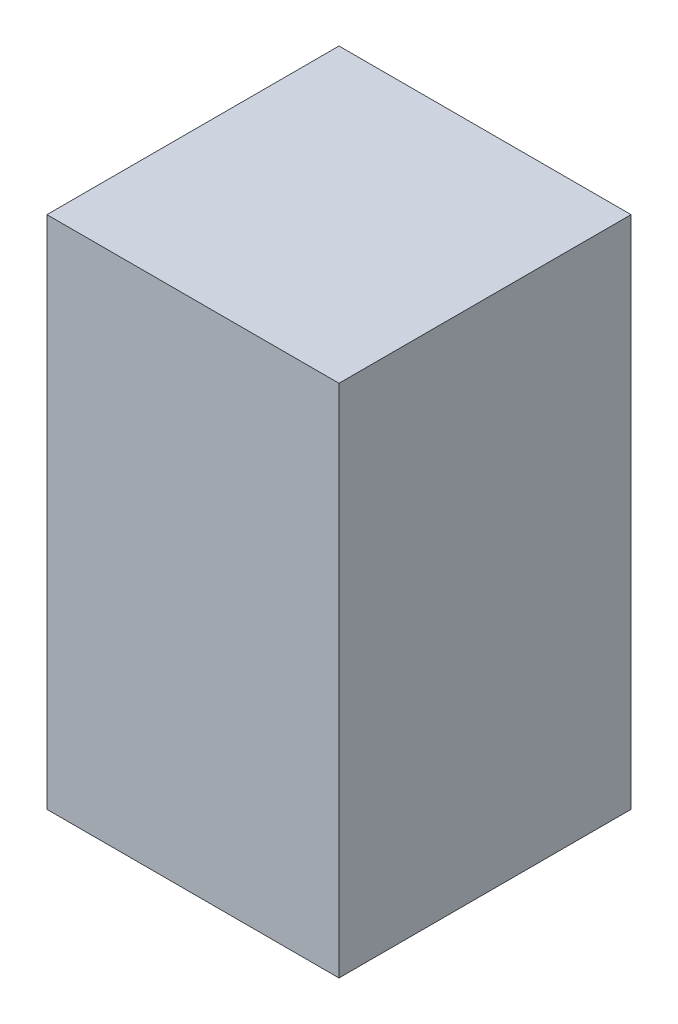
ISO-10303-21;
HEADER;
FILE_DESCRIPTION(('STEP AP214'),'2;1');
FILE_NAME('part.step','',(''),(''),'','','');
FILE_SCHEMA(('AUTOMOTIVE_DESIGN { 1 0 10303 214 1 1 1 1 }'));
ENDSEC;
DATA;
#1=APPLICATION_CONTEXT('core data for automotive mechanical design processes');
#2=APPLICATION_PROTOCOL_DEFINITION('international standard','automotive_design',2000,#1);
#3=PRODUCT_CONTEXT('',#1,'mechanical');
#4=PRODUCT('Part','Part','',(#3));
#5=PRODUCT_RELATED_PRODUCT_CATEGORY('part','',(#4));
#6=PRODUCT_DEFINITION_FORMATION('','',#4);
#7=PRODUCT_DEFINITION_CONTEXT('part definition',#1,'design');
#8=PRODUCT_DEFINITION('design','',#6,#7);
#9=PRODUCT_DEFINITION_SHAPE('','',#8);
#10=(LENGTH_UNIT() NAMED_UNIT(*) SI_UNIT(.MILLI.,.METRE.));
#11=(NAMED_UNIT(*) PLANE_ANGLE_UNIT() SI_UNIT($,.RADIAN.));
#12=(NAMED_UNIT(*) SI_UNIT($,.STERADIAN.) SOLID_ANGLE_UNIT());
#13=UNCERTAINTY_MEASURE_WITH_UNIT(LENGTH_MEASURE(1.E-05),#10,'distance_accuracy_value','');
#14=(GEOMETRIC_REPRESENTATION_CONTEXT(3) GLOBAL_UNCERTAINTY_ASSIGNED_CONTEXT((#13)) GLOBAL_UNIT_ASSIGNED_CONTEXT((#10,
#11,#12)) REPRESENTATION_CONTEXT('',''));
#15=CARTESIAN_POINT('',(0.,0.,0.));
#16=DIRECTION('',(0.,0.,1.));
#17=DIRECTION('',(1.,0.,0.));
#18=AXIS2_PLACEMENT_3D('',#15,#16,#17);
#19=CARTESIAN_POINT('',(609.6,2150.,609.6));
#20=DIRECTION('',(-1.,0.,0.));
#21=DIRECTION('',(0.,0.,1.));
#22=AXIS2_PLACEMENT_3D('',#19,#20,#21);
#23=PLANE('',#22);
#24=DIRECTION('',(0.,0.,-1.));
#25=VECTOR('',#24,1.);
#26=CARTESIAN_POINT('',(609.6,0.,609.6));
#27=LINE('',#26,#25);
#28=CARTESIAN_POINT('',(609.6,0.,609.6));
#29=VERTEX_POINT('',#28);
#30=CARTESIAN_POINT('',(609.6,0.,-609.6));
#31=VERTEX_POINT('',#30);
#32=EDGE_CURVE('E96',#29,#31,#27,.T.);
#33=ORIENTED_EDGE('',*,*,#32,.T.);
#34=DIRECTION('',(0.,-1.,0.));
#35=VECTOR('',#34,1.);
#36=CARTESIAN_POINT('',(609.6,2150.,-609.6));
#37=LINE('',#36,#35);
#38=CARTESIAN_POINT('',(609.6,2150.,-609.6));
#39=VERTEX_POINT('',#38);
#40=EDGE_CURVE('E11',#39,#31,#37,.T.);
#41=ORIENTED_EDGE('',*,*,#40,.F.);
#42=DIRECTION('',(0.,0.,-1.));
#43=VECTOR('',#42,1.);
#44=CARTESIAN_POINT('',(609.6,2150.,609.6));
#45=LINE('',#44,#43);
#46=CARTESIAN_POINT('',(609.6,2150.,609.6));
#47=VERTEX_POINT('',#46);
#48=EDGE_CURVE('E84',#47,#39,#45,.T.);
#49=ORIENTED_EDGE('',*,*,#48,.F.);
#50=DIRECTION('',(0.,-1.,0.));
#51=VECTOR('',#50,1.);
#52=CARTESIAN_POINT('',(609.6,2150.,609.6));
#53=LINE('',#52,#51);
#54=EDGE_CURVE('E92',#47,#29,#53,.T.);
#55=ORIENTED_EDGE('',*,*,#54,.T.);
#56=EDGE_LOOP('',(#33,#41,#49,#55));
#57=FACE_BOUND('',#56,.T.);
#58=ADVANCED_FACE('F33',(#57),#23,.F.);
#59=CARTESIAN_POINT('',(-609.6,2150.,-609.6));
#60=DIRECTION('',(0.,0.,1.));
#61=DIRECTION('',(1.,0.,0.));
#62=AXIS2_PLACEMENT_3D('',#59,#60,#61);
#63=PLANE('',#62);
#64=DIRECTION('',(-1.,0.,0.));
#65=VECTOR('',#64,1.);
#66=CARTESIAN_POINT('',(-609.6,0.,-609.6));
#67=LINE('',#66,#65);
#68=CARTESIAN_POINT('',(-609.6,0.,-609.6));
#69=VERTEX_POINT('',#68);
#70=EDGE_CURVE('E88',#31,#69,#67,.T.);
#71=ORIENTED_EDGE('',*,*,#70,.T.);
#72=DIRECTION('',(0.,-1.,0.));
#73=VECTOR('',#72,1.);
#74=CARTESIAN_POINT('',(-609.6,2150.,-609.6));
#75=LINE('',#74,#73);
#76=CARTESIAN_POINT('',(-609.6,2150.,-609.6));
#77=VERTEX_POINT('',#76);
#78=EDGE_CURVE('E41',#77,#69,#75,.T.);
#79=ORIENTED_EDGE('',*,*,#78,.F.);
#80=DIRECTION('',(-1.,0.,0.));
#81=VECTOR('',#80,1.);
#82=CARTESIAN_POINT('',(-609.6,2150.,-609.6));
#83=LINE('',#82,#81);
#84=EDGE_CURVE('E79',#39,#77,#83,.T.);
#85=ORIENTED_EDGE('',*,*,#84,.F.);
#86=ORIENTED_EDGE('',*,*,#40,.T.);
#87=EDGE_LOOP('',(#71,#79,#85,#86));
#88=FACE_BOUND('',#87,.T.);
#89=ADVANCED_FACE('F87',(#88),#63,.F.);
#90=CARTESIAN_POINT('',(-609.6,2150.,609.6));
#91=DIRECTION('',(1.,0.,0.));
#92=DIRECTION('',(0.,0.,-1.));
#93=AXIS2_PLACEMENT_3D('',#90,#91,#92);
#94=PLANE('',#93);
#95=DIRECTION('',(0.,0.,1.));
#96=VECTOR('',#95,1.);
#97=CARTESIAN_POINT('',(-609.6,0.,609.6));
#98=LINE('',#97,#96);
#99=CARTESIAN_POINT('',(-609.6,0.,609.6));
#100=VERTEX_POINT('',#99);
#101=EDGE_CURVE('E66',#69,#100,#98,.T.);
#102=ORIENTED_EDGE('',*,*,#101,.T.);
#103=DIRECTION('',(0.,-1.,0.));
#104=VECTOR('',#103,1.);
#105=CARTESIAN_POINT('',(-609.6,2150.,609.6));
#106=LINE('',#105,#104);
#107=CARTESIAN_POINT('',(-609.6,2150.,609.6));
#108=VERTEX_POINT('',#107);
#109=EDGE_CURVE('E89',#108,#100,#106,.T.);
#110=ORIENTED_EDGE('',*,*,#109,.F.);
#111=DIRECTION('',(0.,0.,1.));
#112=VECTOR('',#111,1.);
#113=CARTESIAN_POINT('',(-609.6,2150.,609.6));
#114=LINE('',#113,#112);
#115=EDGE_CURVE('E82',#77,#108,#114,.T.);
#116=ORIENTED_EDGE('',*,*,#115,.F.);
#117=ORIENTED_EDGE('',*,*,#78,.T.);
#118=EDGE_LOOP('',(#102,#110,#116,#117));
#119=FACE_BOUND('',#118,.T.);
#120=ADVANCED_FACE('F90',(#119),#94,.F.);
#121=CARTESIAN_POINT('',(-609.6,2150.,609.6));
#122=DIRECTION('',(0.,0.,-1.));
#123=DIRECTION('',(-1.,0.,0.));
#124=AXIS2_PLACEMENT_3D('',#121,#122,#123);
#125=PLANE('',#124);
#126=DIRECTION('',(1.,0.,0.));
#127=VECTOR('',#126,1.);
#128=CARTESIAN_POINT('',(-609.6,0.,609.6));
#129=LINE('',#128,#127);
#130=EDGE_CURVE('E72',#100,#29,#129,.T.);
#131=ORIENTED_EDGE('',*,*,#130,.T.);
#132=ORIENTED_EDGE('',*,*,#54,.F.);
#133=DIRECTION('',(1.,0.,0.));
#134=VECTOR('',#133,1.);
#135=CARTESIAN_POINT('',(-609.6,2150.,609.6));
#136=LINE('',#135,#134);
#137=EDGE_CURVE('E49',#108,#47,#136,.T.);
#138=ORIENTED_EDGE('',*,*,#137,.F.);
#139=ORIENTED_EDGE('',*,*,#109,.T.);
#140=EDGE_LOOP('',(#131,#132,#138,#139));
#141=FACE_BOUND('',#140,.T.);
#142=ADVANCED_FACE('F103',(#141),#125,.F.);
#143=CARTESIAN_POINT('',(0.,2150.,0.));
#144=DIRECTION('',(0.,-1.,0.));
#145=DIRECTION('',(0.,0.,-1.));
#146=AXIS2_PLACEMENT_3D('',#143,#144,#145);
#147=PLANE('',#146);
#148=ORIENTED_EDGE('',*,*,#48,.T.);
#149=ORIENTED_EDGE('',*,*,#84,.T.);
#150=ORIENTED_EDGE('',*,*,#115,.T.);
#151=ORIENTED_EDGE('',*,*,#137,.T.);
#152=EDGE_LOOP('',(#148,#149,#150,#151));
#153=FACE_BOUND('',#152,.T.);
#154=ADVANCED_FACE('F80',(#153),#147,.F.);
#155=CARTESIAN_POINT('',(0.,0.,0.));
#156=DIRECTION('',(0.,-1.,0.));
#157=DIRECTION('',(0.,0.,-1.));
#158=AXIS2_PLACEMENT_3D('',#155,#156,#157);
#159=PLANE('',#158);
#160=ORIENTED_EDGE('',*,*,#32,.F.);
#161=ORIENTED_EDGE('',*,*,#130,.F.);
#162=ORIENTED_EDGE('',*,*,#101,.F.);
#163=ORIENTED_EDGE('',*,*,#70,.F.);
#164=EDGE_LOOP('',(#160,#161,#162,#163));
#165=FACE_BOUND('',#164,.T.);
#166=ADVANCED_FACE('F106',(#165),#159,.T.);
#167=CLOSED_SHELL('',(#58,#89,#120,#142,#154,#166));
#168=MANIFOLD_SOLID_BREP('B2',#167);
#169=ADVANCED_BREP_SHAPE_REPRESENTATION('',(#18,#168),#14);
#170=SHAPE_DEFINITION_REPRESENTATION(#9,#169);
ENDSEC;
END-ISO-10303-21;
